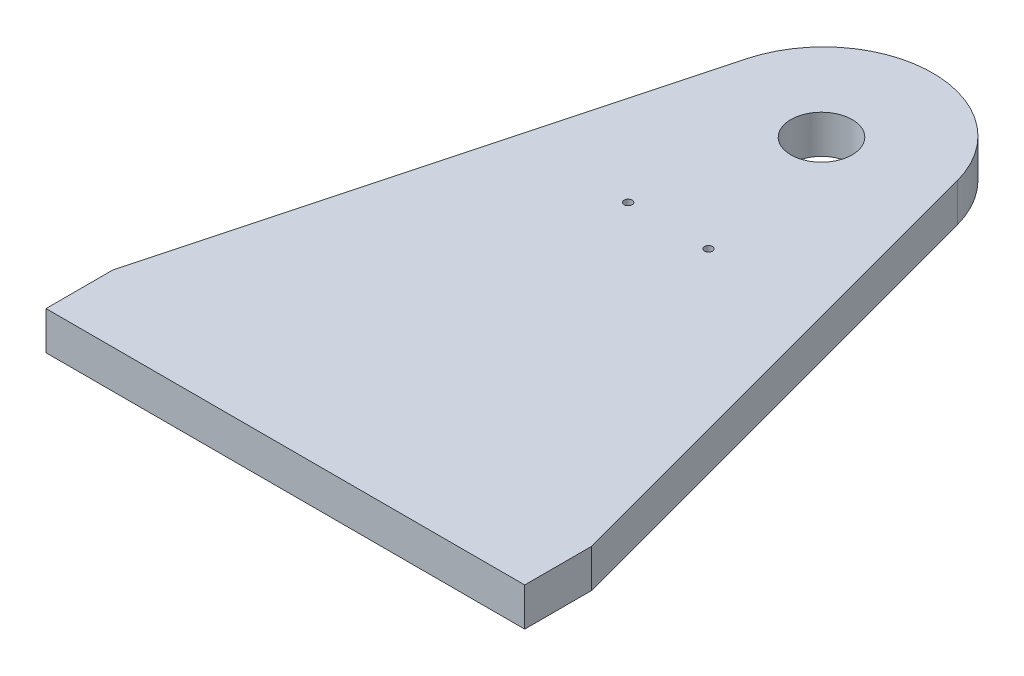
ISO-10303-21;
HEADER;
FILE_DESCRIPTION(('STEP AP214'),'2;1');
FILE_NAME('part.step','',(''),(''),'','','');
FILE_SCHEMA(('AUTOMOTIVE_DESIGN { 1 0 10303 214 1 1 1 1 }'));
ENDSEC;
DATA;
#1=APPLICATION_CONTEXT('core data for automotive mechanical design processes');
#2=APPLICATION_PROTOCOL_DEFINITION('international standard','automotive_design',2000,#1);
#3=PRODUCT_CONTEXT('',#1,'mechanical');
#4=PRODUCT('Part','Part','',(#3));
#5=PRODUCT_RELATED_PRODUCT_CATEGORY('part','',(#4));
#6=PRODUCT_DEFINITION_FORMATION('','',#4);
#7=PRODUCT_DEFINITION_CONTEXT('part definition',#1,'design');
#8=PRODUCT_DEFINITION('design','',#6,#7);
#9=PRODUCT_DEFINITION_SHAPE('','',#8);
#10=(LENGTH_UNIT() NAMED_UNIT(*) SI_UNIT(.MILLI.,.METRE.));
#11=(NAMED_UNIT(*) PLANE_ANGLE_UNIT() SI_UNIT($,.RADIAN.));
#12=(NAMED_UNIT(*) SI_UNIT($,.STERADIAN.) SOLID_ANGLE_UNIT());
#13=UNCERTAINTY_MEASURE_WITH_UNIT(LENGTH_MEASURE(1.E-05),#10,'distance_accuracy_value','');
#14=(GEOMETRIC_REPRESENTATION_CONTEXT(3) GLOBAL_UNCERTAINTY_ASSIGNED_CONTEXT((#13)) GLOBAL_UNIT_ASSIGNED_CONTEXT((#10,
#11,#12)) REPRESENTATION_CONTEXT('',''));
#15=CARTESIAN_POINT('',(0.,0.,0.));
#16=DIRECTION('',(0.,0.,1.));
#17=DIRECTION('',(1.,0.,0.));
#18=AXIS2_PLACEMENT_3D('',#15,#16,#17);
#19=CARTESIAN_POINT('',(0.,20.,-281.030919656832));
#20=DIRECTION('',(0.,-1.,0.));
#21=DIRECTION('',(0.,0.,-1.));
#22=AXIS2_PLACEMENT_3D('',#19,#20,#21);
#23=CYLINDRICAL_SURFACE('',#22,57.0632405948572);
#24=CARTESIAN_POINT('',(0.,0.,-281.030919656832));
#25=DIRECTION('',(0.,1.,0.));
#26=DIRECTION('',(0.,0.,-1.));
#27=AXIS2_PLACEMENT_3D('',#24,#25,#26);
#28=CIRCLE('',#27,57.0632405948572);
#29=CARTESIAN_POINT('',(55.1188578223194,0.,-295.799973098049));
#30=VERTEX_POINT('',#29);
#31=CARTESIAN_POINT('',(-55.1188578223192,0.,-295.799973098048));
#32=VERTEX_POINT('',#31);
#33=EDGE_CURVE('E134',#30,#32,#28,.T.);
#34=ORIENTED_EDGE('',*,*,#33,.T.);
#35=DIRECTION('',(0.,-1.,0.));
#36=VECTOR('',#35,1.);
#37=CARTESIAN_POINT('',(-55.1188578223192,20.,-295.799973098048));
#38=LINE('',#37,#36);
#39=CARTESIAN_POINT('',(-55.1188578223192,20.,-295.799973098048));
#40=VERTEX_POINT('',#39);
#41=EDGE_CURVE('E11',#40,#32,#38,.T.);
#42=ORIENTED_EDGE('',*,*,#41,.F.);
#43=CARTESIAN_POINT('',(0.,20.,-281.030919656832));
#44=DIRECTION('',(0.,1.,0.));
#45=DIRECTION('',(0.,0.,-1.));
#46=AXIS2_PLACEMENT_3D('',#43,#44,#45);
#47=CIRCLE('',#46,57.0632405948572);
#48=CARTESIAN_POINT('',(55.1188578223194,20.,-295.799973098049));
#49=VERTEX_POINT('',#48);
#50=EDGE_CURVE('E151',#49,#40,#47,.T.);
#51=ORIENTED_EDGE('',*,*,#50,.F.);
#52=DIRECTION('',(0.,-1.,0.));
#53=VECTOR('',#52,1.);
#54=CARTESIAN_POINT('',(55.1188578223194,20.,-295.799973098049));
#55=LINE('',#54,#53);
#56=EDGE_CURVE('E130',#49,#30,#55,.T.);
#57=ORIENTED_EDGE('',*,*,#56,.T.);
#58=EDGE_LOOP('',(#34,#42,#51,#57));
#59=FACE_BOUND('',#58,.T.);
#60=ADVANCED_FACE('F45',(#59),#23,.T.);
#61=CARTESIAN_POINT('',(-55.1188578223192,20.,-295.799973098048));
#62=DIRECTION('',(0.965925826289068,0.,0.258819045102521));
#63=DIRECTION('',(0.258819045102521,0.,-0.965925826289068));
#64=AXIS2_PLACEMENT_3D('',#61,#62,#63);
#65=PLANE('',#64);
#66=DIRECTION('',(-0.258819045102521,0.,0.965925826289068));
#67=VECTOR('',#66,1.);
#68=CARTESIAN_POINT('',(-55.1188578223192,0.,-295.799973098048));
#69=LINE('',#68,#67);
#70=CARTESIAN_POINT('',(-125.,0.,-35.));
#71=VERTEX_POINT('',#70);
#72=EDGE_CURVE('E138',#32,#71,#69,.T.);
#73=ORIENTED_EDGE('',*,*,#72,.T.);
#74=DIRECTION('',(0.,-1.,0.));
#75=VECTOR('',#74,1.);
#76=CARTESIAN_POINT('',(-125.,20.,-35.));
#77=LINE('',#76,#75);
#78=CARTESIAN_POINT('',(-125.,20.,-35.));
#79=VERTEX_POINT('',#78);
#80=EDGE_CURVE('E54',#79,#71,#77,.T.);
#81=ORIENTED_EDGE('',*,*,#80,.F.);
#82=DIRECTION('',(-0.258819045102521,0.,0.965925826289068));
#83=VECTOR('',#82,1.);
#84=CARTESIAN_POINT('',(-55.1188578223192,20.,-295.799973098048));
#85=LINE('',#84,#83);
#86=EDGE_CURVE('E99',#40,#79,#85,.T.);
#87=ORIENTED_EDGE('',*,*,#86,.F.);
#88=ORIENTED_EDGE('',*,*,#41,.T.);
#89=EDGE_LOOP('',(#73,#81,#87,#88));
#90=FACE_BOUND('',#89,.T.);
#91=ADVANCED_FACE('F180',(#90),#65,.F.);
#92=CARTESIAN_POINT('',(-125.,20.,-35.));
#93=DIRECTION('',(1.,0.,0.));
#94=DIRECTION('',(0.,0.,-1.));
#95=AXIS2_PLACEMENT_3D('',#92,#93,#94);
#96=PLANE('',#95);
#97=DIRECTION('',(0.,0.,1.));
#98=VECTOR('',#97,1.);
#99=CARTESIAN_POINT('',(-125.,0.,-35.));
#100=LINE('',#99,#98);
#101=CARTESIAN_POINT('',(-125.,0.,0.));
#102=VERTEX_POINT('',#101);
#103=EDGE_CURVE('E142',#71,#102,#100,.T.);
#104=ORIENTED_EDGE('',*,*,#103,.T.);
#105=DIRECTION('',(0.,-1.,0.));
#106=VECTOR('',#105,1.);
#107=CARTESIAN_POINT('',(-125.,20.,0.));
#108=LINE('',#107,#106);
#109=CARTESIAN_POINT('',(-125.,20.,0.));
#110=VERTEX_POINT('',#109);
#111=EDGE_CURVE('E123',#110,#102,#108,.T.);
#112=ORIENTED_EDGE('',*,*,#111,.F.);
#113=DIRECTION('',(0.,0.,1.));
#114=VECTOR('',#113,1.);
#115=CARTESIAN_POINT('',(-125.,20.,-35.));
#116=LINE('',#115,#114);
#117=EDGE_CURVE('E112',#79,#110,#116,.T.);
#118=ORIENTED_EDGE('',*,*,#117,.F.);
#119=ORIENTED_EDGE('',*,*,#80,.T.);
#120=EDGE_LOOP('',(#104,#112,#118,#119));
#121=FACE_BOUND('',#120,.T.);
#122=ADVANCED_FACE('F161',(#121),#96,.F.);
#123=CARTESIAN_POINT('',(-125.,20.,0.));
#124=DIRECTION('',(0.,0.,-1.));
#125=DIRECTION('',(-1.,0.,0.));
#126=AXIS2_PLACEMENT_3D('',#123,#124,#125);
#127=PLANE('',#126);
#128=DIRECTION('',(1.,0.,0.));
#129=VECTOR('',#128,1.);
#130=CARTESIAN_POINT('',(-125.,0.,0.));
#131=LINE('',#130,#129);
#132=CARTESIAN_POINT('',(125.,0.,-1.65926670614978E-13));
#133=VERTEX_POINT('',#132);
#134=EDGE_CURVE('E121',#102,#133,#131,.T.);
#135=ORIENTED_EDGE('',*,*,#134,.T.);
#136=DIRECTION('',(0.,-1.,0.));
#137=VECTOR('',#136,1.);
#138=CARTESIAN_POINT('',(125.,20.,-1.65926670614978E-13));
#139=LINE('',#138,#137);
#140=CARTESIAN_POINT('',(125.,20.,-1.65926670614978E-13));
#141=VERTEX_POINT('',#140);
#142=EDGE_CURVE('E118',#141,#133,#139,.T.);
#143=ORIENTED_EDGE('',*,*,#142,.F.);
#144=DIRECTION('',(1.,0.,0.));
#145=VECTOR('',#144,1.);
#146=CARTESIAN_POINT('',(-125.,20.,0.));
#147=LINE('',#146,#145);
#148=EDGE_CURVE('E106',#110,#141,#147,.T.);
#149=ORIENTED_EDGE('',*,*,#148,.F.);
#150=ORIENTED_EDGE('',*,*,#111,.T.);
#151=EDGE_LOOP('',(#135,#143,#149,#150));
#152=FACE_BOUND('',#151,.T.);
#153=ADVANCED_FACE('F119',(#152),#127,.F.);
#154=CARTESIAN_POINT('',(125.,20.,-1.65926670614978E-13));
#155=DIRECTION('',(-1.,0.,0.));
#156=DIRECTION('',(0.,0.,1.));
#157=AXIS2_PLACEMENT_3D('',#154,#155,#156);
#158=PLANE('',#157);
#159=DIRECTION('',(0.,0.,-1.));
#160=VECTOR('',#159,1.);
#161=CARTESIAN_POINT('',(125.,0.,-1.65926670614978E-13));
#162=LINE('',#161,#160);
#163=CARTESIAN_POINT('',(125.,0.,-35.0000000000001));
#164=VERTEX_POINT('',#163);
#165=EDGE_CURVE('E85',#133,#164,#162,.T.);
#166=ORIENTED_EDGE('',*,*,#165,.T.);
#167=DIRECTION('',(0.,-1.,0.));
#168=VECTOR('',#167,1.);
#169=CARTESIAN_POINT('',(125.,20.,-35.0000000000001));
#170=LINE('',#169,#168);
#171=CARTESIAN_POINT('',(125.,20.,-35.0000000000001));
#172=VERTEX_POINT('',#171);
#173=EDGE_CURVE('E124',#172,#164,#170,.T.);
#174=ORIENTED_EDGE('',*,*,#173,.F.);
#175=DIRECTION('',(0.,0.,-1.));
#176=VECTOR('',#175,1.);
#177=CARTESIAN_POINT('',(125.,20.,-1.65926670614978E-13));
#178=LINE('',#177,#176);
#179=EDGE_CURVE('E110',#141,#172,#178,.T.);
#180=ORIENTED_EDGE('',*,*,#179,.F.);
#181=ORIENTED_EDGE('',*,*,#142,.T.);
#182=EDGE_LOOP('',(#166,#174,#180,#181));
#183=FACE_BOUND('',#182,.T.);
#184=ADVANCED_FACE('F126',(#183),#158,.F.);
#185=CARTESIAN_POINT('',(125.,20.,-35.0000000000001));
#186=DIRECTION('',(-0.965925826289068,0.,0.258819045102521));
#187=DIRECTION('',(0.258819045102521,0.,0.965925826289068));
#188=AXIS2_PLACEMENT_3D('',#185,#186,#187);
#189=PLANE('',#188);
#190=DIRECTION('',(-0.258819045102521,0.,-0.965925826289068));
#191=VECTOR('',#190,1.);
#192=CARTESIAN_POINT('',(125.,0.,-35.0000000000001));
#193=LINE('',#192,#191);
#194=EDGE_CURVE('E91',#164,#30,#193,.T.);
#195=ORIENTED_EDGE('',*,*,#194,.T.);
#196=ORIENTED_EDGE('',*,*,#56,.F.);
#197=DIRECTION('',(-0.258819045102521,0.,-0.965925826289068));
#198=VECTOR('',#197,1.);
#199=CARTESIAN_POINT('',(125.,20.,-35.0000000000001));
#200=LINE('',#199,#198);
#201=EDGE_CURVE('E62',#172,#49,#200,.T.);
#202=ORIENTED_EDGE('',*,*,#201,.F.);
#203=ORIENTED_EDGE('',*,*,#173,.T.);
#204=EDGE_LOOP('',(#195,#196,#202,#203));
#205=FACE_BOUND('',#204,.T.);
#206=ADVANCED_FACE('F168',(#205),#189,.F.);
#207=CARTESIAN_POINT('',(0.,20.,-281.030919656832));
#208=DIRECTION('',(0.,-1.,0.));
#209=DIRECTION('',(0.,0.,-1.));
#210=AXIS2_PLACEMENT_3D('',#207,#208,#209);
#211=PLANE('',#210);
#212=CARTESIAN_POINT('',(-21.,20.,-200.));
#213=DIRECTION('',(0.,1.,0.));
#214=DIRECTION('',(0.,0.,1.));
#215=AXIS2_PLACEMENT_3D('',#212,#213,#214);
#216=CIRCLE('',#215,2.09999999999999);
#217=CARTESIAN_POINT('',(-21.,20.,-197.9));
#218=VERTEX_POINT('',#217);
#219=EDGE_CURVE('E254',#218,#218,#216,.T.);
#220=ORIENTED_EDGE('',*,*,#219,.F.);
#221=EDGE_LOOP('',(#220));
#222=FACE_BOUND('',#221,.T.);
#223=CARTESIAN_POINT('',(21.,20.,-200.));
#224=DIRECTION('',(0.,1.,0.));
#225=DIRECTION('',(0.,0.,-1.));
#226=AXIS2_PLACEMENT_3D('',#223,#224,#225);
#227=CIRCLE('',#226,2.09999999999999);
#228=CARTESIAN_POINT('',(21.,20.,-202.1));
#229=VERTEX_POINT('',#228);
#230=EDGE_CURVE('E260',#229,#229,#227,.T.);
#231=ORIENTED_EDGE('',*,*,#230,.F.);
#232=EDGE_LOOP('',(#231));
#233=FACE_BOUND('',#232,.T.);
#234=CARTESIAN_POINT('',(0.,20.,-280.));
#235=DIRECTION('',(0.,1.,0.));
#236=DIRECTION('',(0.,0.,1.));
#237=AXIS2_PLACEMENT_3D('',#234,#235,#236);
#238=CIRCLE('',#237,16.);
#239=CARTESIAN_POINT('',(0.,20.,-264.));
#240=VERTEX_POINT('',#239);
#241=EDGE_CURVE('E267',#240,#240,#238,.T.);
#242=ORIENTED_EDGE('',*,*,#241,.F.);
#243=EDGE_LOOP('',(#242));
#244=FACE_BOUND('',#243,.T.);
#245=ORIENTED_EDGE('',*,*,#50,.T.);
#246=ORIENTED_EDGE('',*,*,#86,.T.);
#247=ORIENTED_EDGE('',*,*,#117,.T.);
#248=ORIENTED_EDGE('',*,*,#148,.T.);
#249=ORIENTED_EDGE('',*,*,#179,.T.);
#250=ORIENTED_EDGE('',*,*,#201,.T.);
#251=EDGE_LOOP('',(#245,#246,#247,#248,#249,#250));
#252=FACE_BOUND('',#251,.T.);
#253=ADVANCED_FACE('F108',(#222,#233,#244,#252),#211,.F.);
#254=CARTESIAN_POINT('',(0.,0.,-281.030919656832));
#255=DIRECTION('',(0.,-1.,0.));
#256=DIRECTION('',(0.,0.,-1.));
#257=AXIS2_PLACEMENT_3D('',#254,#255,#256);
#258=PLANE('',#257);
#259=CARTESIAN_POINT('',(-21.,0.,-200.));
#260=DIRECTION('',(0.,-1.,0.));
#261=DIRECTION('',(0.,0.,-1.));
#262=AXIS2_PLACEMENT_3D('',#259,#260,#261);
#263=CIRCLE('',#262,2.09999999999999);
#264=CARTESIAN_POINT('',(-21.,0.,-202.1));
#265=VERTEX_POINT('',#264);
#266=EDGE_CURVE('E139',#265,#265,#263,.F.);
#267=ORIENTED_EDGE('',*,*,#266,.T.);
#268=EDGE_LOOP('',(#267));
#269=FACE_BOUND('',#268,.T.);
#270=CARTESIAN_POINT('',(21.,0.,-200.));
#271=DIRECTION('',(0.,-1.,0.));
#272=DIRECTION('',(0.,0.,-1.));
#273=AXIS2_PLACEMENT_3D('',#270,#271,#272);
#274=CIRCLE('',#273,2.09999999999999);
#275=CARTESIAN_POINT('',(21.,0.,-202.1));
#276=VERTEX_POINT('',#275);
#277=EDGE_CURVE('E263',#276,#276,#274,.F.);
#278=ORIENTED_EDGE('',*,*,#277,.T.);
#279=EDGE_LOOP('',(#278));
#280=FACE_BOUND('',#279,.T.);
#281=CARTESIAN_POINT('',(0.,0.,-280.));
#282=DIRECTION('',(0.,-1.,0.));
#283=DIRECTION('',(0.,0.,-1.));
#284=AXIS2_PLACEMENT_3D('',#281,#282,#283);
#285=CIRCLE('',#284,16.);
#286=CARTESIAN_POINT('',(0.,0.,-296.));
#287=VERTEX_POINT('',#286);
#288=EDGE_CURVE('E271',#287,#287,#285,.F.);
#289=ORIENTED_EDGE('',*,*,#288,.T.);
#290=EDGE_LOOP('',(#289));
#291=FACE_BOUND('',#290,.T.);
#292=ORIENTED_EDGE('',*,*,#33,.F.);
#293=ORIENTED_EDGE('',*,*,#194,.F.);
#294=ORIENTED_EDGE('',*,*,#165,.F.);
#295=ORIENTED_EDGE('',*,*,#134,.F.);
#296=ORIENTED_EDGE('',*,*,#103,.F.);
#297=ORIENTED_EDGE('',*,*,#72,.F.);
#298=EDGE_LOOP('',(#292,#293,#294,#295,#296,#297));
#299=FACE_BOUND('',#298,.T.);
#300=ADVANCED_FACE('F164',(#269,#280,#291,#299),#258,.T.);
#301=CARTESIAN_POINT('',(0.,-45.2548339959391,-280.));
#302=DIRECTION('',(0.,1.,0.));
#303=DIRECTION('',(0.,0.,1.));
#304=AXIS2_PLACEMENT_3D('',#301,#302,#303);
#305=CYLINDRICAL_SURFACE('',#304,16.);
#306=ORIENTED_EDGE('',*,*,#241,.T.);
#307=EDGE_LOOP('',(#306));
#308=FACE_BOUND('',#307,.T.);
#309=ORIENTED_EDGE('',*,*,#288,.F.);
#310=EDGE_LOOP('',(#309));
#311=FACE_BOUND('',#310,.T.);
#312=ADVANCED_FACE('F219',(#308,#311),#305,.F.);
#313=CARTESIAN_POINT('',(21.,-45.2548339959391,-200.));
#314=DIRECTION('',(0.,1.,0.));
#315=DIRECTION('',(0.,0.,1.));
#316=AXIS2_PLACEMENT_3D('',#313,#314,#315);
#317=CYLINDRICAL_SURFACE('',#316,2.09999999999999);
#318=ORIENTED_EDGE('',*,*,#230,.T.);
#319=EDGE_LOOP('',(#318));
#320=FACE_BOUND('',#319,.T.);
#321=ORIENTED_EDGE('',*,*,#277,.F.);
#322=EDGE_LOOP('',(#321));
#323=FACE_BOUND('',#322,.T.);
#324=ADVANCED_FACE('F228',(#320,#323),#317,.F.);
#325=CARTESIAN_POINT('',(-21.,-45.2548339959391,-200.));
#326=DIRECTION('',(0.,1.,0.));
#327=DIRECTION('',(0.,0.,1.));
#328=AXIS2_PLACEMENT_3D('',#325,#326,#327);
#329=CYLINDRICAL_SURFACE('',#328,2.09999999999999);
#330=ORIENTED_EDGE('',*,*,#219,.T.);
#331=EDGE_LOOP('',(#330));
#332=FACE_BOUND('',#331,.T.);
#333=ORIENTED_EDGE('',*,*,#266,.F.);
#334=EDGE_LOOP('',(#333));
#335=FACE_BOUND('',#334,.T.);
#336=ADVANCED_FACE('F238',(#332,#335),#329,.F.);
#337=CLOSED_SHELL('',(#60,#91,#122,#153,#184,#206,#253,#300,#312,#324,#336));
#338=MANIFOLD_SOLID_BREP('B2',#337);
#339=ADVANCED_BREP_SHAPE_REPRESENTATION('',(#18,#338),#14);
#340=SHAPE_DEFINITION_REPRESENTATION(#9,#339);
ENDSEC;
END-ISO-10303-21;
